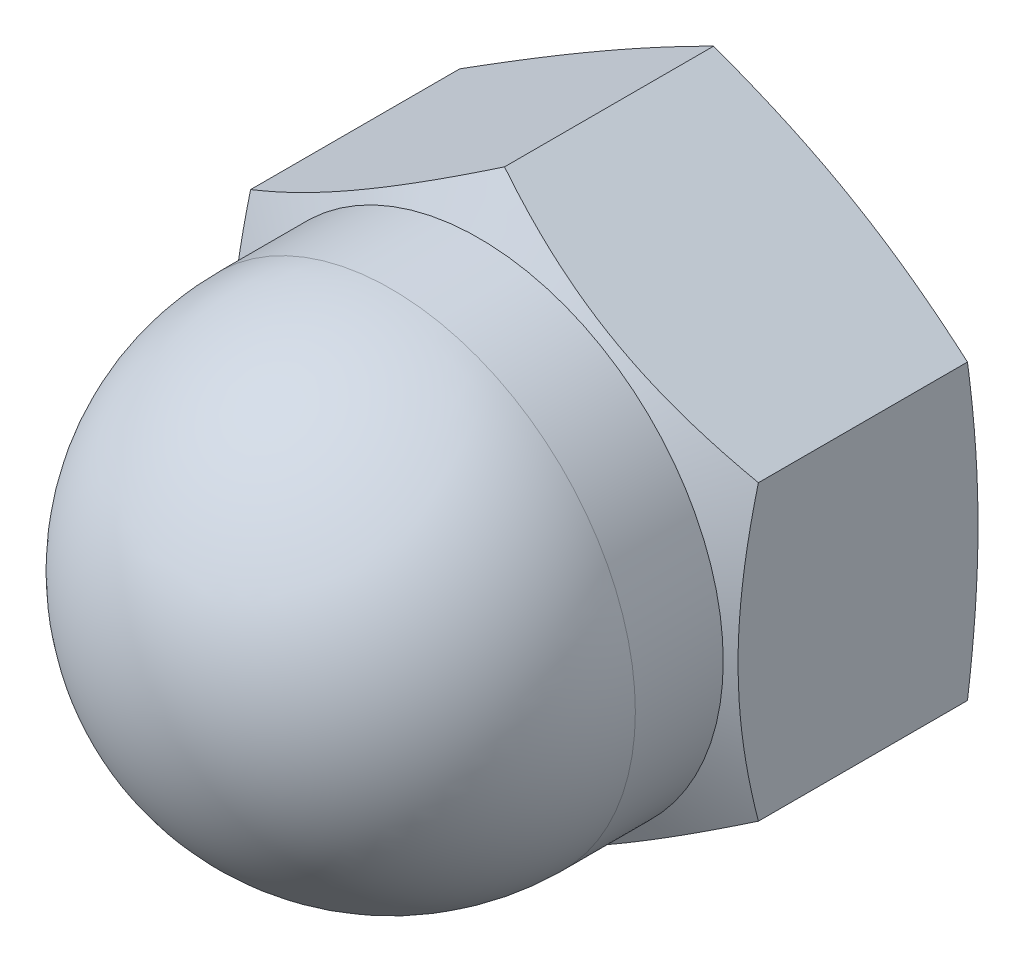
ISO-10303-21;
HEADER;
FILE_DESCRIPTION(('STEP AP214'),'2;1');
FILE_NAME('part.step','',(''),(''),'','','');
FILE_SCHEMA(('AUTOMOTIVE_DESIGN { 1 0 10303 214 1 1 1 1 }'));
ENDSEC;
DATA;
#1=APPLICATION_CONTEXT('core data for automotive mechanical design processes');
#2=APPLICATION_PROTOCOL_DEFINITION('international standard','automotive_design',2000,#1);
#3=PRODUCT_CONTEXT('',#1,'mechanical');
#4=PRODUCT('Part','Part','',(#3));
#5=PRODUCT_RELATED_PRODUCT_CATEGORY('part','',(#4));
#6=PRODUCT_DEFINITION_FORMATION('','',#4);
#7=PRODUCT_DEFINITION_CONTEXT('part definition',#1,'design');
#8=PRODUCT_DEFINITION('design','',#6,#7);
#9=PRODUCT_DEFINITION_SHAPE('','',#8);
#10=(LENGTH_UNIT() NAMED_UNIT(*) SI_UNIT(.MILLI.,.METRE.));
#11=(NAMED_UNIT(*) PLANE_ANGLE_UNIT() SI_UNIT($,.RADIAN.));
#12=(NAMED_UNIT(*) SI_UNIT($,.STERADIAN.) SOLID_ANGLE_UNIT());
#13=UNCERTAINTY_MEASURE_WITH_UNIT(LENGTH_MEASURE(1.E-05),#10,'distance_accuracy_value','');
#14=(GEOMETRIC_REPRESENTATION_CONTEXT(3) GLOBAL_UNCERTAINTY_ASSIGNED_CONTEXT((#13)) GLOBAL_UNIT_ASSIGNED_CONTEXT((#10,
#11,#12)) REPRESENTATION_CONTEXT('',''));
#15=CARTESIAN_POINT('',(0.,0.,0.));
#16=DIRECTION('',(0.,0.,1.));
#17=DIRECTION('',(1.,0.,0.));
#18=AXIS2_PLACEMENT_3D('',#15,#16,#17);
#19=CARTESIAN_POINT('',(3.25,-5.62916512459885,0.));
#20=DIRECTION('',(0.5,-0.866025403784439,0.));
#21=DIRECTION('',(0.866025403784439,0.5,0.));
#22=AXIS2_PLACEMENT_3D('',#19,#20,#21);
#23=PLANE('',#22);
#24=CARTESIAN_POINT('',(0.,-7.50555349946513,5.85));
#25=CARTESIAN_POINT('',(3.25,-5.62916512459886,6.82140619191668));
#26=CARTESIAN_POINT('',(6.5,-3.75277674973258,5.85));
#27=(BOUNDED_CURVE() B_SPLINE_CURVE(2,(#24,#25,#26),.UNSPECIFIED.,.F.,
.F.) B_SPLINE_CURVE_WITH_KNOTS((3,3),(0.,7.57742216684119),
.UNSPECIFIED.) CURVE() GEOMETRIC_REPRESENTATION_ITEM() RATIONAL_B_SPLINE_CURVE((1.,
1.15470053837925,1.)) REPRESENTATION_ITEM(''));
#28=CARTESIAN_POINT('',(0.,-7.50555349946514,5.85));
#29=VERTEX_POINT('',#28);
#30=CARTESIAN_POINT('',(6.5,-3.75277674973257,5.85));
#31=VERTEX_POINT('',#30);
#32=EDGE_CURVE('E91',#29,#31,#27,.T.);
#33=ORIENTED_EDGE('',*,*,#32,.F.);
#34=DIRECTION('',(0.,0.,1.));
#35=VECTOR('',#34,1.);
#36=CARTESIAN_POINT('',(0.,-7.50555349946513,0.));
#37=LINE('',#36,#35);
#38=CARTESIAN_POINT('',(0.,-7.50555349946514,0.497194061694427));
#39=VERTEX_POINT('',#38);
#40=EDGE_CURVE('E121',#39,#29,#37,.T.);
#41=ORIENTED_EDGE('',*,*,#40,.F.);
#42=CARTESIAN_POINT('',(6.5,-3.75277674973257,0.497194061694427));
#43=CARTESIAN_POINT('',(3.25,-5.62916512459886,-0.00558268803814043));
#44=CARTESIAN_POINT('',(0.,-7.50555349946514,0.497194061694427));
#45=(BOUNDED_CURVE() B_SPLINE_CURVE(2,(#42,#43,#44),.UNSPECIFIED.,.F.,
.F.) B_SPLINE_CURVE_WITH_KNOTS((3,3),(0.,7.52487335814022),
.UNSPECIFIED.) CURVE() GEOMETRIC_REPRESENTATION_ITEM() RATIONAL_B_SPLINE_CURVE((1.,
1.15470053837925,1.)) REPRESENTATION_ITEM(''));
#46=CARTESIAN_POINT('',(6.5,-3.75277674973257,0.497194061694427));
#47=VERTEX_POINT('',#46);
#48=EDGE_CURVE('E94',#47,#39,#45,.T.);
#49=ORIENTED_EDGE('',*,*,#48,.F.);
#50=DIRECTION('',(0.,0.,1.));
#51=VECTOR('',#50,1.);
#52=CARTESIAN_POINT('',(6.5,-3.75277674973257,0.));
#53=LINE('',#52,#51);
#54=EDGE_CURVE('E11',#47,#31,#53,.T.);
#55=ORIENTED_EDGE('',*,*,#54,.T.);
#56=EDGE_LOOP('',(#33,#41,#49,#55));
#57=FACE_BOUND('',#56,.T.);
#58=ADVANCED_FACE('F17',(#57),#23,.T.);
#59=CARTESIAN_POINT('',(6.5,0.,0.));
#60=DIRECTION('',(1.,0.,0.));
#61=DIRECTION('',(0.,1.,0.));
#62=AXIS2_PLACEMENT_3D('',#59,#60,#61);
#63=PLANE('',#62);
#64=CARTESIAN_POINT('',(6.5,-3.75277674973258,5.85));
#65=CARTESIAN_POINT('',(6.5,0.,6.82140619191668));
#66=CARTESIAN_POINT('',(6.5,3.75277674973257,5.85));
#67=(BOUNDED_CURVE() B_SPLINE_CURVE(2,(#64,#65,#66),.UNSPECIFIED.,.F.,
.F.) B_SPLINE_CURVE_WITH_KNOTS((3,3),(0.,7.57742216684121),
.UNSPECIFIED.) CURVE() GEOMETRIC_REPRESENTATION_ITEM() RATIONAL_B_SPLINE_CURVE((1.,
1.15470053837925,1.)) REPRESENTATION_ITEM(''));
#68=CARTESIAN_POINT('',(6.5,3.75277674973256,5.85));
#69=VERTEX_POINT('',#68);
#70=EDGE_CURVE('E99',#31,#69,#67,.T.);
#71=ORIENTED_EDGE('',*,*,#70,.F.);
#72=ORIENTED_EDGE('',*,*,#54,.F.);
#73=CARTESIAN_POINT('',(6.5,3.75277674973256,0.497194061694426));
#74=CARTESIAN_POINT('',(6.5,0.,-0.00558268803814127));
#75=CARTESIAN_POINT('',(6.5,-3.75277674973257,0.497194061694427));
#76=(BOUNDED_CURVE() B_SPLINE_CURVE(2,(#73,#74,#75),.UNSPECIFIED.,.F.,
.F.) B_SPLINE_CURVE_WITH_KNOTS((3,3),(0.,7.52487335814022),
.UNSPECIFIED.) CURVE() GEOMETRIC_REPRESENTATION_ITEM() RATIONAL_B_SPLINE_CURVE((1.,
1.15470053837925,1.)) REPRESENTATION_ITEM(''));
#77=CARTESIAN_POINT('',(6.5,3.75277674973256,0.497194061694426));
#78=VERTEX_POINT('',#77);
#79=EDGE_CURVE('E171',#78,#47,#76,.T.);
#80=ORIENTED_EDGE('',*,*,#79,.F.);
#81=DIRECTION('',(0.,0.,1.));
#82=VECTOR('',#81,1.);
#83=CARTESIAN_POINT('',(6.5,3.75277674973256,0.));
#84=LINE('',#83,#82);
#85=EDGE_CURVE('E29',#78,#69,#84,.T.);
#86=ORIENTED_EDGE('',*,*,#85,.T.);
#87=EDGE_LOOP('',(#71,#72,#80,#86));
#88=FACE_BOUND('',#87,.T.);
#89=ADVANCED_FACE('F100',(#88),#63,.T.);
#90=CARTESIAN_POINT('',(0.,0.,0.));
#91=DIRECTION('',(0.,0.,1.));
#92=DIRECTION('',(1.,0.,0.));
#93=AXIS2_PLACEMENT_3D('',#90,#91,#92);
#94=PLANE('',#93);
#95=CARTESIAN_POINT('',(0.,0.,0.));
#96=DIRECTION('',(0.,0.,1.));
#97=DIRECTION('',(1.,0.,0.));
#98=AXIS2_PLACEMENT_3D('',#95,#96,#97);
#99=CIRCLE('',#98,5.65);
#100=CARTESIAN_POINT('',(5.65,0.,0.));
#101=VERTEX_POINT('',#100);
#102=EDGE_CURVE('E135',#101,#101,#99,.T.);
#103=ORIENTED_EDGE('',*,*,#102,.F.);
#104=EDGE_LOOP('',(#103));
#105=FACE_BOUND('',#104,.T.);
#106=CARTESIAN_POINT('',(0.,0.,0.));
#107=DIRECTION('',(0.,0.,1.));
#108=DIRECTION('',(1.,0.,0.));
#109=AXIS2_PLACEMENT_3D('',#106,#107,#108);
#110=CIRCLE('',#109,4.);
#111=CARTESIAN_POINT('',(4.,0.,0.));
#112=VERTEX_POINT('',#111);
#113=EDGE_CURVE('E129',#112,#112,#110,.T.);
#114=ORIENTED_EDGE('',*,*,#113,.T.);
#115=EDGE_LOOP('',(#114));
#116=FACE_BOUND('',#115,.T.);
#117=ADVANCED_FACE('F220',(#105,#116),#94,.F.);
#118=CARTESIAN_POINT('',(3.25,5.62916512459885,0.));
#119=DIRECTION('',(0.5,0.866025403784439,0.));
#120=DIRECTION('',(-0.866025403784439,0.5,0.));
#121=AXIS2_PLACEMENT_3D('',#118,#119,#120);
#122=PLANE('',#121);
#123=CARTESIAN_POINT('',(6.5,3.75277674973256,5.85));
#124=CARTESIAN_POINT('',(3.25,5.62916512459886,6.82140619191668));
#125=CARTESIAN_POINT('',(0.,7.50555349946514,5.85));
#126=(BOUNDED_CURVE() B_SPLINE_CURVE(2,(#123,#124,#125),.UNSPECIFIED.,.F.,
.F.) B_SPLINE_CURVE_WITH_KNOTS((3,3),(0.,7.5774221668412),
.UNSPECIFIED.) CURVE() GEOMETRIC_REPRESENTATION_ITEM() RATIONAL_B_SPLINE_CURVE((1.,
1.15470053837925,1.)) REPRESENTATION_ITEM(''));
#127=CARTESIAN_POINT('',(0.,7.50555349946514,5.85));
#128=VERTEX_POINT('',#127);
#129=EDGE_CURVE('E141',#69,#128,#126,.T.);
#130=ORIENTED_EDGE('',*,*,#129,.F.);
#131=ORIENTED_EDGE('',*,*,#85,.F.);
#132=CARTESIAN_POINT('',(0.,7.50555349946514,0.497194061694426));
#133=CARTESIAN_POINT('',(3.25,5.62916512459885,-0.00558268803814111));
#134=CARTESIAN_POINT('',(6.5,3.75277674973256,0.497194061694426));
#135=(BOUNDED_CURVE() B_SPLINE_CURVE(2,(#132,#133,#134),.UNSPECIFIED.,.F.,
.F.) B_SPLINE_CURVE_WITH_KNOTS((3,3),(0.,7.52487335814022),
.UNSPECIFIED.) CURVE() GEOMETRIC_REPRESENTATION_ITEM() RATIONAL_B_SPLINE_CURVE((1.,
1.15470053837925,1.)) REPRESENTATION_ITEM(''));
#136=CARTESIAN_POINT('',(0.,7.50555349946514,0.497194061694426));
#137=VERTEX_POINT('',#136);
#138=EDGE_CURVE('E174',#137,#78,#135,.T.);
#139=ORIENTED_EDGE('',*,*,#138,.F.);
#140=DIRECTION('',(0.,0.,1.));
#141=VECTOR('',#140,1.);
#142=CARTESIAN_POINT('',(0.,7.50555349946513,0.));
#143=LINE('',#142,#141);
#144=EDGE_CURVE('E168',#137,#128,#143,.T.);
#145=ORIENTED_EDGE('',*,*,#144,.T.);
#146=EDGE_LOOP('',(#130,#131,#139,#145));
#147=FACE_BOUND('',#146,.T.);
#148=ADVANCED_FACE('F217',(#147),#122,.T.);
#149=CARTESIAN_POINT('',(-3.25,5.62916512459885,0.));
#150=DIRECTION('',(-0.5,0.866025403784439,0.));
#151=DIRECTION('',(-0.866025403784439,-0.5,0.));
#152=AXIS2_PLACEMENT_3D('',#149,#150,#151);
#153=PLANE('',#152);
#154=CARTESIAN_POINT('',(0.,7.50555349946514,5.85));
#155=CARTESIAN_POINT('',(-3.25,5.62916512459885,6.82140619191668));
#156=CARTESIAN_POINT('',(-6.5,3.75277674973256,5.85));
#157=(BOUNDED_CURVE() B_SPLINE_CURVE(2,(#154,#155,#156),.UNSPECIFIED.,.F.,
.F.) B_SPLINE_CURVE_WITH_KNOTS((3,3),(0.,7.57742216684121),
.UNSPECIFIED.) CURVE() GEOMETRIC_REPRESENTATION_ITEM() RATIONAL_B_SPLINE_CURVE((1.,
1.15470053837925,1.)) REPRESENTATION_ITEM(''));
#158=CARTESIAN_POINT('',(-6.5,3.75277674973257,5.85));
#159=VERTEX_POINT('',#158);
#160=EDGE_CURVE('E21',#128,#159,#157,.T.);
#161=ORIENTED_EDGE('',*,*,#160,.F.);
#162=ORIENTED_EDGE('',*,*,#144,.F.);
#163=CARTESIAN_POINT('',(-6.5,3.75277674973256,0.497194061694426));
#164=CARTESIAN_POINT('',(-3.25,5.62916512459883,-0.00558268803814151));
#165=CARTESIAN_POINT('',(0.,7.50555349946513,0.497194061694426));
#166=(BOUNDED_CURVE() B_SPLINE_CURVE(2,(#163,#164,#165),.UNSPECIFIED.,.F.,
.F.) B_SPLINE_CURVE_WITH_KNOTS((3,3),(0.,7.52487335814022),
.UNSPECIFIED.) CURVE() GEOMETRIC_REPRESENTATION_ITEM() RATIONAL_B_SPLINE_CURVE((1.,
1.15470053837926,1.)) REPRESENTATION_ITEM(''));
#167=CARTESIAN_POINT('',(-6.5,3.75277674973257,0.497194061694426));
#168=VERTEX_POINT('',#167);
#169=EDGE_CURVE('E130',#168,#137,#166,.T.);
#170=ORIENTED_EDGE('',*,*,#169,.F.);
#171=DIRECTION('',(0.,0.,1.));
#172=VECTOR('',#171,1.);
#173=CARTESIAN_POINT('',(-6.5,3.75277674973257,0.));
#174=LINE('',#173,#172);
#175=EDGE_CURVE('E126',#168,#159,#174,.T.);
#176=ORIENTED_EDGE('',*,*,#175,.T.);
#177=EDGE_LOOP('',(#161,#162,#170,#176));
#178=FACE_BOUND('',#177,.T.);
#179=ADVANCED_FACE('F215',(#178),#153,.T.);
#180=CARTESIAN_POINT('',(-6.5,0.,0.));
#181=DIRECTION('',(-1.,0.,0.));
#182=DIRECTION('',(0.,-1.,0.));
#183=AXIS2_PLACEMENT_3D('',#180,#181,#182);
#184=PLANE('',#183);
#185=CARTESIAN_POINT('',(-6.5,3.75277674973258,5.85));
#186=CARTESIAN_POINT('',(-6.5,0.,6.82140619191668));
#187=CARTESIAN_POINT('',(-6.5,-3.75277674973257,5.85));
#188=(BOUNDED_CURVE() B_SPLINE_CURVE(2,(#185,#186,#187),.UNSPECIFIED.,.F.,
.F.) B_SPLINE_CURVE_WITH_KNOTS((3,3),(0.,7.57742216684121),
.UNSPECIFIED.) CURVE() GEOMETRIC_REPRESENTATION_ITEM() RATIONAL_B_SPLINE_CURVE((1.,
1.15470053837925,1.)) REPRESENTATION_ITEM(''));
#189=CARTESIAN_POINT('',(-6.5,-3.75277674973256,5.85));
#190=VERTEX_POINT('',#189);
#191=EDGE_CURVE('E111',#159,#190,#188,.T.);
#192=ORIENTED_EDGE('',*,*,#191,.F.);
#193=ORIENTED_EDGE('',*,*,#175,.F.);
#194=CARTESIAN_POINT('',(-6.5,-3.75277674973256,0.497194061694427));
#195=CARTESIAN_POINT('',(-6.5,0.,-0.0055826880381411));
#196=CARTESIAN_POINT('',(-6.5,3.75277674973256,0.497194061694426));
#197=(BOUNDED_CURVE() B_SPLINE_CURVE(2,(#194,#195,#196),.UNSPECIFIED.,.F.,
.F.) B_SPLINE_CURVE_WITH_KNOTS((3,3),(0.,7.52487335814022),
.UNSPECIFIED.) CURVE() GEOMETRIC_REPRESENTATION_ITEM() RATIONAL_B_SPLINE_CURVE((1.,
1.15470053837925,1.)) REPRESENTATION_ITEM(''));
#198=CARTESIAN_POINT('',(-6.5,-3.75277674973256,0.497194061694427));
#199=VERTEX_POINT('',#198);
#200=EDGE_CURVE('E136',#199,#168,#197,.T.);
#201=ORIENTED_EDGE('',*,*,#200,.F.);
#202=DIRECTION('',(0.,0.,1.));
#203=VECTOR('',#202,1.);
#204=CARTESIAN_POINT('',(-6.5,-3.75277674973256,0.));
#205=LINE('',#204,#203);
#206=EDGE_CURVE('E127',#199,#190,#205,.T.);
#207=ORIENTED_EDGE('',*,*,#206,.T.);
#208=EDGE_LOOP('',(#192,#193,#201,#207));
#209=FACE_BOUND('',#208,.T.);
#210=ADVANCED_FACE('F210',(#209),#184,.T.);
#211=CARTESIAN_POINT('',(-3.25,-5.62916512459885,0.));
#212=DIRECTION('',(-0.5,-0.866025403784439,0.));
#213=DIRECTION('',(0.866025403784439,-0.5,0.));
#214=AXIS2_PLACEMENT_3D('',#211,#212,#213);
#215=PLANE('',#214);
#216=CARTESIAN_POINT('',(-6.5,-3.75277674973256,5.85));
#217=CARTESIAN_POINT('',(-3.25,-5.62916512459884,6.82140619191668));
#218=CARTESIAN_POINT('',(0.,-7.50555349946514,5.85));
#219=(BOUNDED_CURVE() B_SPLINE_CURVE(2,(#216,#217,#218),.UNSPECIFIED.,.F.,
.F.) B_SPLINE_CURVE_WITH_KNOTS((3,3),(0.,7.5774221668412),
.UNSPECIFIED.) CURVE() GEOMETRIC_REPRESENTATION_ITEM() RATIONAL_B_SPLINE_CURVE((1.,
1.15470053837925,1.)) REPRESENTATION_ITEM(''));
#220=EDGE_CURVE('E109',#190,#29,#219,.T.);
#221=ORIENTED_EDGE('',*,*,#220,.F.);
#222=ORIENTED_EDGE('',*,*,#206,.F.);
#223=CARTESIAN_POINT('',(0.,-7.50555349946513,0.497194061694427));
#224=CARTESIAN_POINT('',(-3.25,-5.62916512459885,-0.00558268803814098));
#225=CARTESIAN_POINT('',(-6.5,-3.75277674973256,0.497194061694426));
#226=(BOUNDED_CURVE() B_SPLINE_CURVE(2,(#223,#224,#225),.UNSPECIFIED.,.F.,
.F.) B_SPLINE_CURVE_WITH_KNOTS((3,3),(0.,7.52487335814022),
.UNSPECIFIED.) CURVE() GEOMETRIC_REPRESENTATION_ITEM() RATIONAL_B_SPLINE_CURVE((1.,
1.15470053837925,1.)) REPRESENTATION_ITEM(''));
#227=EDGE_CURVE('E117',#39,#199,#226,.T.);
#228=ORIENTED_EDGE('',*,*,#227,.F.);
#229=ORIENTED_EDGE('',*,*,#40,.T.);
#230=EDGE_LOOP('',(#221,#222,#228,#229));
#231=FACE_BOUND('',#230,.T.);
#232=ADVANCED_FACE('F19',(#231),#215,.T.);
#233=CARTESIAN_POINT('',(0.,0.,8.75));
#234=DIRECTION('',(0.,-1.,0.));
#235=DIRECTION('',(1.,0.,0.));
#236=AXIS2_PLACEMENT_3D('',#233,#234,#235);
#237=SPHERICAL_SURFACE('',#236,6.25);
#238=CARTESIAN_POINT('',(0.,0.,8.75));
#239=DIRECTION('',(0.,0.,1.));
#240=DIRECTION('',(1.,0.,0.));
#241=AXIS2_PLACEMENT_3D('',#238,#239,#240);
#242=SPHERICAL_SURFACE('',#241,6.25);
#243=CARTESIAN_POINT('',(0.,0.,8.75));
#244=DIRECTION('',(0.,0.,1.));
#245=DIRECTION('',(1.,0.,0.));
#246=AXIS2_PLACEMENT_3D('',#243,#244,#245);
#247=CIRCLE('',#246,6.25);
#248=CARTESIAN_POINT('',(6.25,0.,8.75));
#249=VERTEX_POINT('',#248);
#250=EDGE_CURVE('E36',#249,#249,#247,.T.);
#251=ORIENTED_EDGE('',*,*,#250,.T.);
#252=EDGE_LOOP('',(#251));
#253=FACE_BOUND('',#252,.T.);
#254=ADVANCED_FACE('F244',(#253),#242,.T.);
#255=CARTESIAN_POINT('',(0.,0.,7.625));
#256=DIRECTION('',(0.,0.,-1.));
#257=DIRECTION('',(1.,0.,0.));
#258=AXIS2_PLACEMENT_3D('',#255,#256,#257);
#259=CYLINDRICAL_SURFACE('',#258,6.25);
#260=CARTESIAN_POINT('',(0.,0.,6.5));
#261=DIRECTION('',(0.,0.,1.));
#262=DIRECTION('',(1.,0.,0.));
#263=AXIS2_PLACEMENT_3D('',#260,#261,#262);
#264=CIRCLE('',#263,6.25);
#265=CARTESIAN_POINT('',(6.25,0.,6.5));
#266=VERTEX_POINT('',#265);
#267=EDGE_CURVE('E104',#266,#266,#264,.T.);
#268=ORIENTED_EDGE('',*,*,#267,.T.);
#269=EDGE_LOOP('',(#268));
#270=FACE_BOUND('',#269,.T.);
#271=ORIENTED_EDGE('',*,*,#250,.F.);
#272=EDGE_LOOP('',(#271));
#273=FACE_BOUND('',#272,.T.);
#274=ADVANCED_FACE('F246',(#270,#273),#259,.T.);
#275=CARTESIAN_POINT('',(0.,0.,6.175));
#276=DIRECTION('',(0.,0.,-1.));
#277=DIRECTION('',(1.,0.,0.));
#278=AXIS2_PLACEMENT_3D('',#275,#276,#277);
#279=CONICAL_SURFACE('',#278,6.87777674973257,1.09308922156705);
#280=ORIENTED_EDGE('',*,*,#267,.F.);
#281=EDGE_LOOP('',(#280));
#282=FACE_BOUND('',#281,.T.);
#283=ORIENTED_EDGE('',*,*,#129,.T.);
#284=ORIENTED_EDGE('',*,*,#160,.T.);
#285=ORIENTED_EDGE('',*,*,#191,.T.);
#286=ORIENTED_EDGE('',*,*,#220,.T.);
#287=ORIENTED_EDGE('',*,*,#32,.T.);
#288=ORIENTED_EDGE('',*,*,#70,.T.);
#289=EDGE_LOOP('',(#283,#284,#285,#286,#287,#288));
#290=FACE_BOUND('',#289,.T.);
#291=ADVANCED_FACE('F106',(#282,#290),#279,.T.);
#292=CARTESIAN_POINT('',(0.,0.,0.248597030847214));
#293=DIRECTION('',(0.,0.,1.));
#294=DIRECTION('',(1.,0.,0.));
#295=AXIS2_PLACEMENT_3D('',#292,#293,#294);
#296=CONICAL_SURFACE('',#295,6.57777674973257,1.30899693899575);
#297=ORIENTED_EDGE('',*,*,#102,.T.);
#298=EDGE_LOOP('',(#297));
#299=FACE_BOUND('',#298,.T.);
#300=ORIENTED_EDGE('',*,*,#138,.T.);
#301=ORIENTED_EDGE('',*,*,#79,.T.);
#302=ORIENTED_EDGE('',*,*,#48,.T.);
#303=ORIENTED_EDGE('',*,*,#227,.T.);
#304=ORIENTED_EDGE('',*,*,#200,.T.);
#305=ORIENTED_EDGE('',*,*,#169,.T.);
#306=EDGE_LOOP('',(#300,#301,#302,#303,#304,#305));
#307=FACE_BOUND('',#306,.T.);
#308=ADVANCED_FACE('F208',(#299,#307),#296,.T.);
#309=CARTESIAN_POINT('',(0.,0.,11.6093937676299));
#310=DIRECTION('',(0.,0.,-1.));
#311=DIRECTION('',(1.,0.,0.));
#312=AXIS2_PLACEMENT_3D('',#309,#310,#311);
#313=CONICAL_SURFACE('',#312,1.66171875,1.0471975511966);
#314=CARTESIAN_POINT('',(0.,0.,10.65));
#315=DIRECTION('',(0.,0.,1.));
#316=DIRECTION('',(1.,0.,0.));
#317=AXIS2_PLACEMENT_3D('',#314,#315,#316);
#318=CIRCLE('',#317,3.3234375);
#319=CARTESIAN_POINT('',(3.3234375,0.,10.65));
#320=VERTEX_POINT('',#319);
#321=EDGE_CURVE('E140',#320,#320,#318,.T.);
#322=ORIENTED_EDGE('',*,*,#321,.F.);
#323=EDGE_LOOP('',(#322));
#324=FACE_BOUND('',#323,.T.);
#325=CARTESIAN_POINT('',(0.,0.,12.5687875352599));
#326=VERTEX_POINT('',#325);
#327=VERTEX_LOOP('',#326);
#328=FACE_BOUND('',#327,.T.);
#329=ADVANCED_FACE('F260',(#324,#328),#313,.F.);
#330=CARTESIAN_POINT('',(0.,0.,5.5203067707493));
#331=DIRECTION('',(0.,0.,-1.));
#332=DIRECTION('',(1.,0.,0.));
#333=AXIS2_PLACEMENT_3D('',#330,#331,#332);
#334=CYLINDRICAL_SURFACE('',#333,3.3234375);
#335=CARTESIAN_POINT('',(0.,0.,0.390613541498606));
#336=DIRECTION('',(0.,0.,1.));
#337=DIRECTION('',(1.,0.,0.));
#338=AXIS2_PLACEMENT_3D('',#335,#336,#337);
#339=CIRCLE('',#338,3.3234375);
#340=CARTESIAN_POINT('',(3.3234375,0.,0.390613541498606));
#341=VERTEX_POINT('',#340);
#342=EDGE_CURVE('E72',#341,#341,#339,.T.);
#343=ORIENTED_EDGE('',*,*,#342,.F.);
#344=EDGE_LOOP('',(#343));
#345=FACE_BOUND('',#344,.T.);
#346=ORIENTED_EDGE('',*,*,#321,.T.);
#347=EDGE_LOOP('',(#346));
#348=FACE_BOUND('',#347,.T.);
#349=ADVANCED_FACE('F242',(#345,#348),#334,.F.);
#350=CARTESIAN_POINT('',(0.,0.,0.195306770749303));
#351=DIRECTION('',(0.,0.,-1.));
#352=DIRECTION('',(1.,0.,0.));
#353=AXIS2_PLACEMENT_3D('',#350,#351,#352);
#354=CONICAL_SURFACE('',#353,3.66171875,1.0471975511966);
#355=ORIENTED_EDGE('',*,*,#113,.F.);
#356=EDGE_LOOP('',(#355));
#357=FACE_BOUND('',#356,.T.);
#358=ORIENTED_EDGE('',*,*,#342,.T.);
#359=EDGE_LOOP('',(#358));
#360=FACE_BOUND('',#359,.T.);
#361=ADVANCED_FACE('F240',(#357,#360),#354,.F.);
#362=CLOSED_SHELL('',(#58,#89,#117,#148,#179,#210,#232,#254,#274,#291,#308,#329,#349,#361));
#363=MANIFOLD_SOLID_BREP('B1',#362);
#364=ADVANCED_BREP_SHAPE_REPRESENTATION('',(#18,#363),#14);
#365=SHAPE_DEFINITION_REPRESENTATION(#9,#364);
ENDSEC;
END-ISO-10303-21;
